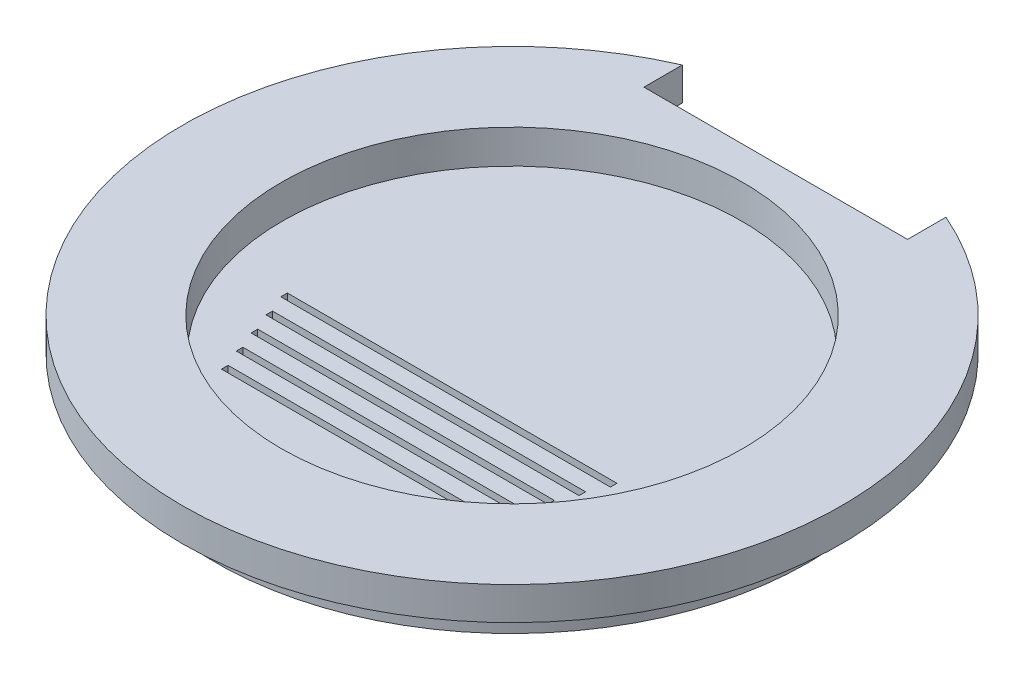
ISO-10303-21;
HEADER;
FILE_DESCRIPTION(('STEP AP214'),'2;1');
FILE_NAME('part.step','',(''),(''),'','','');
FILE_SCHEMA(('AUTOMOTIVE_DESIGN { 1 0 10303 214 1 1 1 1 }'));
ENDSEC;
DATA;
#1=APPLICATION_CONTEXT('core data for automotive mechanical design processes');
#2=APPLICATION_PROTOCOL_DEFINITION('international standard','automotive_design',2000,#1);
#3=PRODUCT_CONTEXT('',#1,'mechanical');
#4=PRODUCT('Part','Part','',(#3));
#5=PRODUCT_RELATED_PRODUCT_CATEGORY('part','',(#4));
#6=PRODUCT_DEFINITION_FORMATION('','',#4);
#7=PRODUCT_DEFINITION_CONTEXT('part definition',#1,'design');
#8=PRODUCT_DEFINITION('design','',#6,#7);
#9=PRODUCT_DEFINITION_SHAPE('','',#8);
#10=(LENGTH_UNIT() NAMED_UNIT(*) SI_UNIT(.MILLI.,.METRE.));
#11=(NAMED_UNIT(*) PLANE_ANGLE_UNIT() SI_UNIT($,.RADIAN.));
#12=(NAMED_UNIT(*) SI_UNIT($,.STERADIAN.) SOLID_ANGLE_UNIT());
#13=UNCERTAINTY_MEASURE_WITH_UNIT(LENGTH_MEASURE(1.E-05),#10,'distance_accuracy_value','');
#14=(GEOMETRIC_REPRESENTATION_CONTEXT(3) GLOBAL_UNCERTAINTY_ASSIGNED_CONTEXT((#13)) GLOBAL_UNIT_ASSIGNED_CONTEXT((#10,
#11,#12)) REPRESENTATION_CONTEXT('',''));
#15=CARTESIAN_POINT('',(0.,0.,0.));
#16=DIRECTION('',(0.,0.,1.));
#17=DIRECTION('',(1.,0.,0.));
#18=AXIS2_PLACEMENT_3D('',#15,#16,#17);
#19=CARTESIAN_POINT('',(40.,-10.,0.));
#20=DIRECTION('',(1.,0.,0.));
#21=DIRECTION('',(0.,0.,-1.));
#22=AXIS2_PLACEMENT_3D('',#19,#20,#21);
#23=PLANE('',#22);
#24=DIRECTION('',(0.,0.,1.));
#25=VECTOR('',#24,1.);
#26=CARTESIAN_POINT('',(40.,0.,0.));
#27=LINE('',#26,#25);
#28=CARTESIAN_POINT('',(40.,0.,46.1733036196664));
#29=VERTEX_POINT('',#28);
#30=CARTESIAN_POINT('',(40.,0.,48.1733036196664));
#31=VERTEX_POINT('',#30);
#32=EDGE_CURVE('E372',#29,#31,#27,.T.);
#33=ORIENTED_EDGE('',*,*,#32,.F.);
#34=DIRECTION('',(0.,1.,0.));
#35=VECTOR('',#34,1.);
#36=CARTESIAN_POINT('',(40.,-10.,46.1733036196664));
#37=LINE('',#36,#35);
#38=CARTESIAN_POINT('',(40.,-10.,46.1733036196664));
#39=VERTEX_POINT('',#38);
#40=EDGE_CURVE('E355',#39,#29,#37,.T.);
#41=ORIENTED_EDGE('',*,*,#40,.F.);
#42=DIRECTION('',(0.,0.,-1.));
#43=VECTOR('',#42,1.);
#44=CARTESIAN_POINT('',(40.,-10.,0.));
#45=LINE('',#44,#43);
#46=CARTESIAN_POINT('',(40.,-10.,48.1733036196664));
#47=VERTEX_POINT('',#46);
#48=EDGE_CURVE('E341',#47,#39,#45,.T.);
#49=ORIENTED_EDGE('',*,*,#48,.F.);
#50=DIRECTION('',(0.,1.,0.));
#51=VECTOR('',#50,1.);
#52=CARTESIAN_POINT('',(40.,-10.,48.1733036196664));
#53=LINE('',#52,#51);
#54=EDGE_CURVE('E368',#47,#31,#53,.T.);
#55=ORIENTED_EDGE('',*,*,#54,.T.);
#56=EDGE_LOOP('',(#33,#41,#49,#55));
#57=FACE_BOUND('',#56,.T.);
#58=ADVANCED_FACE('F39',(#57),#23,.F.);
#59=CARTESIAN_POINT('',(0.,-10.,48.1733036196664));
#60=DIRECTION('',(0.,0.,-1.));
#61=DIRECTION('',(-1.,0.,0.));
#62=AXIS2_PLACEMENT_3D('',#59,#60,#61);
#63=PLANE('',#62);
#64=DIRECTION('',(0.,1.,0.));
#65=VECTOR('',#64,1.);
#66=CARTESIAN_POINT('',(-40.,-10.,48.1733036196664));
#67=LINE('',#66,#65);
#68=CARTESIAN_POINT('',(-40.,-10.,48.1733036196664));
#69=VERTEX_POINT('',#68);
#70=CARTESIAN_POINT('',(-40.,0.,48.1733036196664));
#71=VERTEX_POINT('',#70);
#72=EDGE_CURVE('E364',#69,#71,#67,.T.);
#73=ORIENTED_EDGE('',*,*,#72,.T.);
#74=DIRECTION('',(1.,0.,0.));
#75=VECTOR('',#74,1.);
#76=CARTESIAN_POINT('',(0.,0.,48.1733036196664));
#77=LINE('',#76,#75);
#78=EDGE_CURVE('E584',#71,#31,#77,.T.);
#79=ORIENTED_EDGE('',*,*,#78,.T.);
#80=ORIENTED_EDGE('',*,*,#54,.F.);
#81=DIRECTION('',(-1.,0.,0.));
#82=VECTOR('',#81,1.);
#83=CARTESIAN_POINT('',(0.,-10.,48.1733036196664));
#84=LINE('',#83,#82);
#85=EDGE_CURVE('E359',#47,#69,#84,.T.);
#86=ORIENTED_EDGE('',*,*,#85,.T.);
#87=EDGE_LOOP('',(#73,#79,#80,#86));
#88=FACE_BOUND('',#87,.T.);
#89=ADVANCED_FACE('F484',(#88),#63,.T.);
#90=CARTESIAN_POINT('',(-40.,-10.,0.));
#91=DIRECTION('',(1.,0.,0.));
#92=DIRECTION('',(0.,0.,-1.));
#93=AXIS2_PLACEMENT_3D('',#90,#91,#92);
#94=PLANE('',#93);
#95=DIRECTION('',(0.,1.,0.));
#96=VECTOR('',#95,1.);
#97=CARTESIAN_POINT('',(-40.,-10.,46.1733036196664));
#98=LINE('',#97,#96);
#99=CARTESIAN_POINT('',(-40.,-10.,46.1733036196664));
#100=VERTEX_POINT('',#99);
#101=CARTESIAN_POINT('',(-40.,0.,46.1733036196664));
#102=VERTEX_POINT('',#101);
#103=EDGE_CURVE('E360',#100,#102,#98,.T.);
#104=ORIENTED_EDGE('',*,*,#103,.T.);
#105=DIRECTION('',(0.,0.,1.));
#106=VECTOR('',#105,1.);
#107=CARTESIAN_POINT('',(-40.,0.,0.));
#108=LINE('',#107,#106);
#109=EDGE_CURVE('E55',#102,#71,#108,.T.);
#110=ORIENTED_EDGE('',*,*,#109,.T.);
#111=ORIENTED_EDGE('',*,*,#72,.F.);
#112=DIRECTION('',(0.,0.,-1.));
#113=VECTOR('',#112,1.);
#114=CARTESIAN_POINT('',(-40.,-10.,0.));
#115=LINE('',#114,#113);
#116=EDGE_CURVE('E375',#69,#100,#115,.T.);
#117=ORIENTED_EDGE('',*,*,#116,.T.);
#118=EDGE_LOOP('',(#104,#110,#111,#117));
#119=FACE_BOUND('',#118,.T.);
#120=ADVANCED_FACE('F490',(#119),#94,.T.);
#121=CARTESIAN_POINT('',(0.,-10.,46.1733036196664));
#122=DIRECTION('',(0.,0.,-1.));
#123=DIRECTION('',(-1.,0.,0.));
#124=AXIS2_PLACEMENT_3D('',#121,#122,#123);
#125=PLANE('',#124);
#126=DIRECTION('',(1.,0.,0.));
#127=VECTOR('',#126,1.);
#128=CARTESIAN_POINT('',(0.,0.,46.1733036196664));
#129=LINE('',#128,#127);
#130=EDGE_CURVE('E590',#102,#29,#129,.T.);
#131=ORIENTED_EDGE('',*,*,#130,.F.);
#132=ORIENTED_EDGE('',*,*,#103,.F.);
#133=DIRECTION('',(-1.,0.,0.));
#134=VECTOR('',#133,1.);
#135=CARTESIAN_POINT('',(0.,-10.,46.1733036196664));
#136=LINE('',#135,#134);
#137=EDGE_CURVE('E379',#39,#100,#136,.T.);
#138=ORIENTED_EDGE('',*,*,#137,.F.);
#139=ORIENTED_EDGE('',*,*,#40,.T.);
#140=EDGE_LOOP('',(#131,#132,#138,#139));
#141=FACE_BOUND('',#140,.T.);
#142=ADVANCED_FACE('F498',(#141),#125,.F.);
#143=CARTESIAN_POINT('',(42.5000000000001,-10.,1.47451495458029E-13));
#144=DIRECTION('',(1.,0.,0.));
#145=DIRECTION('',(0.,0.,-1.));
#146=AXIS2_PLACEMENT_3D('',#143,#144,#145);
#147=PLANE('',#146);
#148=DIRECTION('',(0.,0.,1.));
#149=VECTOR('',#148,1.);
#150=CARTESIAN_POINT('',(42.5000000000001,0.,1.47451495458029E-13));
#151=LINE('',#150,#149);
#152=CARTESIAN_POINT('',(42.5,0.,39.1733036196664));
#153=VERTEX_POINT('',#152);
#154=CARTESIAN_POINT('',(42.5,0.,41.1733036196664));
#155=VERTEX_POINT('',#154);
#156=EDGE_CURVE('E593',#153,#155,#151,.T.);
#157=ORIENTED_EDGE('',*,*,#156,.F.);
#158=DIRECTION('',(0.,1.,0.));
#159=VECTOR('',#158,1.);
#160=CARTESIAN_POINT('',(42.5,-10.,39.1733036196664));
#161=LINE('',#160,#159);
#162=CARTESIAN_POINT('',(42.5,-10.,39.1733036196664));
#163=VERTEX_POINT('',#162);
#164=EDGE_CURVE('E324',#163,#153,#161,.T.);
#165=ORIENTED_EDGE('',*,*,#164,.F.);
#166=DIRECTION('',(0.,0.,-1.));
#167=VECTOR('',#166,1.);
#168=CARTESIAN_POINT('',(42.5000000000001,-10.,1.47451495458029E-13));
#169=LINE('',#168,#167);
#170=CARTESIAN_POINT('',(42.5,-10.,41.1733036196664));
#171=VERTEX_POINT('',#170);
#172=EDGE_CURVE('E310',#171,#163,#169,.T.);
#173=ORIENTED_EDGE('',*,*,#172,.F.);
#174=DIRECTION('',(0.,1.,0.));
#175=VECTOR('',#174,1.);
#176=CARTESIAN_POINT('',(42.5,-10.,41.1733036196664));
#177=LINE('',#176,#175);
#178=EDGE_CURVE('E337',#171,#155,#177,.T.);
#179=ORIENTED_EDGE('',*,*,#178,.T.);
#180=EDGE_LOOP('',(#157,#165,#173,#179));
#181=FACE_BOUND('',#180,.T.);
#182=ADVANCED_FACE('F501',(#181),#147,.F.);
#183=CARTESIAN_POINT('',(0.,-10.,41.1733036196664));
#184=DIRECTION('',(0.,0.,-1.));
#185=DIRECTION('',(-1.,0.,0.));
#186=AXIS2_PLACEMENT_3D('',#183,#184,#185);
#187=PLANE('',#186);
#188=DIRECTION('',(0.,1.,0.));
#189=VECTOR('',#188,1.);
#190=CARTESIAN_POINT('',(-42.5,-10.,41.1733036196664));
#191=LINE('',#190,#189);
#192=CARTESIAN_POINT('',(-42.5,-10.,41.1733036196664));
#193=VERTEX_POINT('',#192);
#194=CARTESIAN_POINT('',(-42.5,0.,41.1733036196664));
#195=VERTEX_POINT('',#194);
#196=EDGE_CURVE('E333',#193,#195,#191,.T.);
#197=ORIENTED_EDGE('',*,*,#196,.T.);
#198=DIRECTION('',(1.,0.,0.));
#199=VECTOR('',#198,1.);
#200=CARTESIAN_POINT('',(0.,0.,41.1733036196664));
#201=LINE('',#200,#199);
#202=EDGE_CURVE('E596',#195,#155,#201,.T.);
#203=ORIENTED_EDGE('',*,*,#202,.T.);
#204=ORIENTED_EDGE('',*,*,#178,.F.);
#205=DIRECTION('',(-1.,0.,0.));
#206=VECTOR('',#205,1.);
#207=CARTESIAN_POINT('',(0.,-10.,41.1733036196664));
#208=LINE('',#207,#206);
#209=EDGE_CURVE('E328',#171,#193,#208,.T.);
#210=ORIENTED_EDGE('',*,*,#209,.T.);
#211=EDGE_LOOP('',(#197,#203,#204,#210));
#212=FACE_BOUND('',#211,.T.);
#213=ADVANCED_FACE('F496',(#212),#187,.T.);
#214=CARTESIAN_POINT('',(-42.5000000000001,-10.,1.47451495458029E-13));
#215=DIRECTION('',(1.,0.,0.));
#216=DIRECTION('',(0.,0.,-1.));
#217=AXIS2_PLACEMENT_3D('',#214,#215,#216);
#218=PLANE('',#217);
#219=DIRECTION('',(0.,1.,0.));
#220=VECTOR('',#219,1.);
#221=CARTESIAN_POINT('',(-42.5,-10.,39.1733036196664));
#222=LINE('',#221,#220);
#223=CARTESIAN_POINT('',(-42.5,-10.,39.1733036196664));
#224=VERTEX_POINT('',#223);
#225=CARTESIAN_POINT('',(-42.5,0.,39.1733036196664));
#226=VERTEX_POINT('',#225);
#227=EDGE_CURVE('E329',#224,#226,#222,.T.);
#228=ORIENTED_EDGE('',*,*,#227,.T.);
#229=DIRECTION('',(0.,0.,1.));
#230=VECTOR('',#229,1.);
#231=CARTESIAN_POINT('',(-42.5000000000001,0.,1.47451495458029E-13));
#232=LINE('',#231,#230);
#233=EDGE_CURVE('E63',#226,#195,#232,.T.);
#234=ORIENTED_EDGE('',*,*,#233,.T.);
#235=ORIENTED_EDGE('',*,*,#196,.F.);
#236=DIRECTION('',(0.,0.,-1.));
#237=VECTOR('',#236,1.);
#238=CARTESIAN_POINT('',(-42.5000000000001,-10.,1.47451495458029E-13));
#239=LINE('',#238,#237);
#240=EDGE_CURVE('E344',#193,#224,#239,.T.);
#241=ORIENTED_EDGE('',*,*,#240,.T.);
#242=EDGE_LOOP('',(#228,#234,#235,#241));
#243=FACE_BOUND('',#242,.T.);
#244=ADVANCED_FACE('F703',(#243),#218,.T.);
#245=CARTESIAN_POINT('',(0.,-10.,39.1733036196664));
#246=DIRECTION('',(0.,0.,-1.));
#247=DIRECTION('',(-1.,0.,0.));
#248=AXIS2_PLACEMENT_3D('',#245,#246,#247);
#249=PLANE('',#248);
#250=DIRECTION('',(1.,0.,0.));
#251=VECTOR('',#250,1.);
#252=CARTESIAN_POINT('',(0.,0.,39.1733036196664));
#253=LINE('',#252,#251);
#254=EDGE_CURVE('E602',#226,#153,#253,.T.);
#255=ORIENTED_EDGE('',*,*,#254,.F.);
#256=ORIENTED_EDGE('',*,*,#227,.F.);
#257=DIRECTION('',(-1.,0.,0.));
#258=VECTOR('',#257,1.);
#259=CARTESIAN_POINT('',(0.,-10.,39.1733036196664));
#260=LINE('',#259,#258);
#261=EDGE_CURVE('E348',#163,#224,#260,.T.);
#262=ORIENTED_EDGE('',*,*,#261,.F.);
#263=ORIENTED_EDGE('',*,*,#164,.T.);
#264=EDGE_LOOP('',(#255,#256,#262,#263));
#265=FACE_BOUND('',#264,.T.);
#266=ADVANCED_FACE('F687',(#265),#249,.F.);
#267=CARTESIAN_POINT('',(44.9999999999999,-10.,-1.56125112837912E-13));
#268=DIRECTION('',(1.,0.,0.));
#269=DIRECTION('',(0.,0.,-1.));
#270=AXIS2_PLACEMENT_3D('',#267,#268,#269);
#271=PLANE('',#270);
#272=DIRECTION('',(0.,0.,1.));
#273=VECTOR('',#272,1.);
#274=CARTESIAN_POINT('',(44.9999999999999,0.,-1.56125112837912E-13));
#275=LINE('',#274,#273);
#276=CARTESIAN_POINT('',(45.,0.,32.1733036196664));
#277=VERTEX_POINT('',#276);
#278=CARTESIAN_POINT('',(45.,0.,34.1733036196664));
#279=VERTEX_POINT('',#278);
#280=EDGE_CURVE('E605',#277,#279,#275,.T.);
#281=ORIENTED_EDGE('',*,*,#280,.F.);
#282=DIRECTION('',(0.,1.,0.));
#283=VECTOR('',#282,1.);
#284=CARTESIAN_POINT('',(45.,-10.,32.1733036196664));
#285=LINE('',#284,#283);
#286=CARTESIAN_POINT('',(45.,-10.,32.1733036196664));
#287=VERTEX_POINT('',#286);
#288=EDGE_CURVE('E293',#287,#277,#285,.T.);
#289=ORIENTED_EDGE('',*,*,#288,.F.);
#290=DIRECTION('',(0.,0.,-1.));
#291=VECTOR('',#290,1.);
#292=CARTESIAN_POINT('',(44.9999999999999,-10.,-1.56125112837912E-13));
#293=LINE('',#292,#291);
#294=CARTESIAN_POINT('',(45.,-10.,34.1733036196664));
#295=VERTEX_POINT('',#294);
#296=EDGE_CURVE('E277',#295,#287,#293,.T.);
#297=ORIENTED_EDGE('',*,*,#296,.F.);
#298=DIRECTION('',(0.,1.,0.));
#299=VECTOR('',#298,1.);
#300=CARTESIAN_POINT('',(45.,-10.,34.1733036196664));
#301=LINE('',#300,#299);
#302=EDGE_CURVE('E306',#295,#279,#301,.T.);
#303=ORIENTED_EDGE('',*,*,#302,.T.);
#304=EDGE_LOOP('',(#281,#289,#297,#303));
#305=FACE_BOUND('',#304,.T.);
#306=ADVANCED_FACE('F683',(#305),#271,.F.);
#307=CARTESIAN_POINT('',(0.,-10.,34.1733036196664));
#308=DIRECTION('',(0.,0.,-1.));
#309=DIRECTION('',(-1.,0.,0.));
#310=AXIS2_PLACEMENT_3D('',#307,#308,#309);
#311=PLANE('',#310);
#312=DIRECTION('',(0.,1.,0.));
#313=VECTOR('',#312,1.);
#314=CARTESIAN_POINT('',(-45.,-10.,34.1733036196664));
#315=LINE('',#314,#313);
#316=CARTESIAN_POINT('',(-45.,-10.,34.1733036196664));
#317=VERTEX_POINT('',#316);
#318=CARTESIAN_POINT('',(-45.,0.,34.1733036196664));
#319=VERTEX_POINT('',#318);
#320=EDGE_CURVE('E302',#317,#319,#315,.T.);
#321=ORIENTED_EDGE('',*,*,#320,.T.);
#322=DIRECTION('',(1.,0.,0.));
#323=VECTOR('',#322,1.);
#324=CARTESIAN_POINT('',(0.,0.,34.1733036196664));
#325=LINE('',#324,#323);
#326=EDGE_CURVE('E608',#319,#279,#325,.T.);
#327=ORIENTED_EDGE('',*,*,#326,.T.);
#328=ORIENTED_EDGE('',*,*,#302,.F.);
#329=DIRECTION('',(-1.,0.,0.));
#330=VECTOR('',#329,1.);
#331=CARTESIAN_POINT('',(0.,-10.,34.1733036196664));
#332=LINE('',#331,#330);
#333=EDGE_CURVE('E297',#295,#317,#332,.T.);
#334=ORIENTED_EDGE('',*,*,#333,.T.);
#335=EDGE_LOOP('',(#321,#327,#328,#334));
#336=FACE_BOUND('',#335,.T.);
#337=ADVANCED_FACE('F686',(#336),#311,.T.);
#338=CARTESIAN_POINT('',(-44.9999999999999,-10.,-1.56125112837912E-13));
#339=DIRECTION('',(1.,0.,0.));
#340=DIRECTION('',(0.,0.,-1.));
#341=AXIS2_PLACEMENT_3D('',#338,#339,#340);
#342=PLANE('',#341);
#343=DIRECTION('',(0.,1.,0.));
#344=VECTOR('',#343,1.);
#345=CARTESIAN_POINT('',(-45.,-10.,32.1733036196664));
#346=LINE('',#345,#344);
#347=CARTESIAN_POINT('',(-45.,-10.,32.1733036196664));
#348=VERTEX_POINT('',#347);
#349=CARTESIAN_POINT('',(-45.,0.,32.1733036196664));
#350=VERTEX_POINT('',#349);
#351=EDGE_CURVE('E298',#348,#350,#346,.T.);
#352=ORIENTED_EDGE('',*,*,#351,.T.);
#353=DIRECTION('',(0.,0.,1.));
#354=VECTOR('',#353,1.);
#355=CARTESIAN_POINT('',(-44.9999999999999,0.,-1.56125112837912E-13));
#356=LINE('',#355,#354);
#357=EDGE_CURVE('E612',#350,#319,#356,.T.);
#358=ORIENTED_EDGE('',*,*,#357,.T.);
#359=ORIENTED_EDGE('',*,*,#320,.F.);
#360=DIRECTION('',(0.,0.,-1.));
#361=VECTOR('',#360,1.);
#362=CARTESIAN_POINT('',(-44.9999999999999,-10.,-1.56125112837912E-13));
#363=LINE('',#362,#361);
#364=EDGE_CURVE('E313',#317,#348,#363,.T.);
#365=ORIENTED_EDGE('',*,*,#364,.T.);
#366=EDGE_LOOP('',(#352,#358,#359,#365));
#367=FACE_BOUND('',#366,.T.);
#368=ADVANCED_FACE('F691',(#367),#342,.T.);
#369=CARTESIAN_POINT('',(0.,-10.,32.1733036196664));
#370=DIRECTION('',(0.,0.,-1.));
#371=DIRECTION('',(-1.,0.,0.));
#372=AXIS2_PLACEMENT_3D('',#369,#370,#371);
#373=PLANE('',#372);
#374=DIRECTION('',(1.,0.,0.));
#375=VECTOR('',#374,1.);
#376=CARTESIAN_POINT('',(0.,0.,32.1733036196664));
#377=LINE('',#376,#375);
#378=EDGE_CURVE('E616',#350,#277,#377,.T.);
#379=ORIENTED_EDGE('',*,*,#378,.F.);
#380=ORIENTED_EDGE('',*,*,#351,.F.);
#381=DIRECTION('',(-1.,0.,0.));
#382=VECTOR('',#381,1.);
#383=CARTESIAN_POINT('',(0.,-10.,32.1733036196664));
#384=LINE('',#383,#382);
#385=EDGE_CURVE('E317',#287,#348,#384,.T.);
#386=ORIENTED_EDGE('',*,*,#385,.F.);
#387=ORIENTED_EDGE('',*,*,#288,.T.);
#388=EDGE_LOOP('',(#379,#380,#386,#387));
#389=FACE_BOUND('',#388,.T.);
#390=ADVANCED_FACE('F671',(#389),#373,.F.);
#391=CARTESIAN_POINT('',(47.5000000000001,-10.,1.64798730217797E-13));
#392=DIRECTION('',(1.,0.,0.));
#393=DIRECTION('',(0.,0.,-1.));
#394=AXIS2_PLACEMENT_3D('',#391,#392,#393);
#395=PLANE('',#394);
#396=DIRECTION('',(0.,0.,1.));
#397=VECTOR('',#396,1.);
#398=CARTESIAN_POINT('',(47.5000000000001,0.,1.64798730217797E-13));
#399=LINE('',#398,#397);
#400=CARTESIAN_POINT('',(47.5,0.,25.1733036196664));
#401=VERTEX_POINT('',#400);
#402=CARTESIAN_POINT('',(47.5,0.,27.1733036196664));
#403=VERTEX_POINT('',#402);
#404=EDGE_CURVE('E619',#401,#403,#399,.T.);
#405=ORIENTED_EDGE('',*,*,#404,.F.);
#406=DIRECTION('',(0.,1.,0.));
#407=VECTOR('',#406,1.);
#408=CARTESIAN_POINT('',(47.5,-10.,25.1733036196664));
#409=LINE('',#408,#407);
#410=CARTESIAN_POINT('',(47.5,-10.,25.1733036196664));
#411=VERTEX_POINT('',#410);
#412=EDGE_CURVE('E260',#411,#401,#409,.T.);
#413=ORIENTED_EDGE('',*,*,#412,.F.);
#414=DIRECTION('',(0.,0.,-1.));
#415=VECTOR('',#414,1.);
#416=CARTESIAN_POINT('',(47.5000000000001,-10.,1.64798730217797E-13));
#417=LINE('',#416,#415);
#418=CARTESIAN_POINT('',(47.5,-10.,27.1733036196664));
#419=VERTEX_POINT('',#418);
#420=EDGE_CURVE('E288',#419,#411,#417,.T.);
#421=ORIENTED_EDGE('',*,*,#420,.F.);
#422=DIRECTION('',(0.,1.,0.));
#423=VECTOR('',#422,1.);
#424=CARTESIAN_POINT('',(47.5,-10.,27.1733036196664));
#425=LINE('',#424,#423);
#426=EDGE_CURVE('E273',#419,#403,#425,.T.);
#427=ORIENTED_EDGE('',*,*,#426,.T.);
#428=EDGE_LOOP('',(#405,#413,#421,#427));
#429=FACE_BOUND('',#428,.T.);
#430=ADVANCED_FACE('F667',(#429),#395,.F.);
#431=CARTESIAN_POINT('',(0.,-10.,27.1733036196664));
#432=DIRECTION('',(0.,0.,-1.));
#433=DIRECTION('',(-1.,0.,0.));
#434=AXIS2_PLACEMENT_3D('',#431,#432,#433);
#435=PLANE('',#434);
#436=DIRECTION('',(0.,1.,0.));
#437=VECTOR('',#436,1.);
#438=CARTESIAN_POINT('',(-47.5,-10.,27.1733036196664));
#439=LINE('',#438,#437);
#440=CARTESIAN_POINT('',(-47.5,-10.,27.1733036196664));
#441=VERTEX_POINT('',#440);
#442=CARTESIAN_POINT('',(-47.5,0.,27.1733036196664));
#443=VERTEX_POINT('',#442);
#444=EDGE_CURVE('E269',#441,#443,#439,.T.);
#445=ORIENTED_EDGE('',*,*,#444,.T.);
#446=DIRECTION('',(1.,0.,0.));
#447=VECTOR('',#446,1.);
#448=CARTESIAN_POINT('',(0.,0.,27.1733036196664));
#449=LINE('',#448,#447);
#450=EDGE_CURVE('E622',#443,#403,#449,.T.);
#451=ORIENTED_EDGE('',*,*,#450,.T.);
#452=ORIENTED_EDGE('',*,*,#426,.F.);
#453=DIRECTION('',(-1.,0.,0.));
#454=VECTOR('',#453,1.);
#455=CARTESIAN_POINT('',(0.,-10.,27.1733036196664));
#456=LINE('',#455,#454);
#457=EDGE_CURVE('E264',#419,#441,#456,.T.);
#458=ORIENTED_EDGE('',*,*,#457,.T.);
#459=EDGE_LOOP('',(#445,#451,#452,#458));
#460=FACE_BOUND('',#459,.T.);
#461=ADVANCED_FACE('F670',(#460),#435,.T.);
#462=CARTESIAN_POINT('',(-47.5000000000001,-10.,1.64798730217797E-13));
#463=DIRECTION('',(1.,0.,0.));
#464=DIRECTION('',(0.,0.,-1.));
#465=AXIS2_PLACEMENT_3D('',#462,#463,#464);
#466=PLANE('',#465);
#467=DIRECTION('',(0.,1.,0.));
#468=VECTOR('',#467,1.);
#469=CARTESIAN_POINT('',(-47.5,-10.,25.1733036196664));
#470=LINE('',#469,#468);
#471=CARTESIAN_POINT('',(-47.5,-10.,25.1733036196664));
#472=VERTEX_POINT('',#471);
#473=CARTESIAN_POINT('',(-47.5,0.,25.1733036196664));
#474=VERTEX_POINT('',#473);
#475=EDGE_CURVE('E265',#472,#474,#470,.T.);
#476=ORIENTED_EDGE('',*,*,#475,.T.);
#477=DIRECTION('',(0.,0.,1.));
#478=VECTOR('',#477,1.);
#479=CARTESIAN_POINT('',(-47.5000000000001,0.,1.64798730217797E-13));
#480=LINE('',#479,#478);
#481=EDGE_CURVE('E626',#474,#443,#480,.T.);
#482=ORIENTED_EDGE('',*,*,#481,.T.);
#483=ORIENTED_EDGE('',*,*,#444,.F.);
#484=DIRECTION('',(0.,0.,-1.));
#485=VECTOR('',#484,1.);
#486=CARTESIAN_POINT('',(-47.5000000000001,-10.,1.64798730217797E-13));
#487=LINE('',#486,#485);
#488=EDGE_CURVE('E280',#441,#472,#487,.T.);
#489=ORIENTED_EDGE('',*,*,#488,.T.);
#490=EDGE_LOOP('',(#476,#482,#483,#489));
#491=FACE_BOUND('',#490,.T.);
#492=ADVANCED_FACE('F675',(#491),#466,.T.);
#493=CARTESIAN_POINT('',(0.,-10.,25.1733036196664));
#494=DIRECTION('',(0.,0.,-1.));
#495=DIRECTION('',(-1.,0.,0.));
#496=AXIS2_PLACEMENT_3D('',#493,#494,#495);
#497=PLANE('',#496);
#498=DIRECTION('',(1.,0.,0.));
#499=VECTOR('',#498,1.);
#500=CARTESIAN_POINT('',(0.,0.,25.1733036196664));
#501=LINE('',#500,#499);
#502=EDGE_CURVE('E241',#474,#401,#501,.T.);
#503=ORIENTED_EDGE('',*,*,#502,.F.);
#504=ORIENTED_EDGE('',*,*,#475,.F.);
#505=DIRECTION('',(-1.,0.,0.));
#506=VECTOR('',#505,1.);
#507=CARTESIAN_POINT('',(0.,-10.,25.1733036196664));
#508=LINE('',#507,#506);
#509=EDGE_CURVE('E284',#411,#472,#508,.T.);
#510=ORIENTED_EDGE('',*,*,#509,.F.);
#511=ORIENTED_EDGE('',*,*,#412,.T.);
#512=EDGE_LOOP('',(#503,#504,#510,#511));
#513=FACE_BOUND('',#512,.T.);
#514=ADVANCED_FACE('F666',(#513),#497,.F.);
#515=CARTESIAN_POINT('',(50.,-10.,0.));
#516=DIRECTION('',(1.,0.,0.));
#517=DIRECTION('',(0.,0.,-1.));
#518=AXIS2_PLACEMENT_3D('',#515,#516,#517);
#519=PLANE('',#518);
#520=DIRECTION('',(0.,0.,1.));
#521=VECTOR('',#520,1.);
#522=CARTESIAN_POINT('',(50.,0.,0.));
#523=LINE('',#522,#521);
#524=CARTESIAN_POINT('',(50.,0.,18.1733036196664));
#525=VERTEX_POINT('',#524);
#526=CARTESIAN_POINT('',(50.,0.,20.1733036196664));
#527=VERTEX_POINT('',#526);
#528=EDGE_CURVE('E226',#525,#527,#523,.T.);
#529=ORIENTED_EDGE('',*,*,#528,.F.);
#530=DIRECTION('',(0.,1.,0.));
#531=VECTOR('',#530,1.);
#532=CARTESIAN_POINT('',(50.,-10.,18.1733036196664));
#533=LINE('',#532,#531);
#534=CARTESIAN_POINT('',(50.,-10.,18.1733036196664));
#535=VERTEX_POINT('',#534);
#536=EDGE_CURVE('E237',#535,#525,#533,.T.);
#537=ORIENTED_EDGE('',*,*,#536,.F.);
#538=DIRECTION('',(0.,0.,-1.));
#539=VECTOR('',#538,1.);
#540=CARTESIAN_POINT('',(50.,-10.,0.));
#541=LINE('',#540,#539);
#542=CARTESIAN_POINT('',(50.,-10.,20.1733036196664));
#543=VERTEX_POINT('',#542);
#544=EDGE_CURVE('E292',#543,#535,#541,.T.);
#545=ORIENTED_EDGE('',*,*,#544,.F.);
#546=DIRECTION('',(0.,1.,0.));
#547=VECTOR('',#546,1.);
#548=CARTESIAN_POINT('',(50.,-10.,20.1733036196664));
#549=LINE('',#548,#547);
#550=EDGE_CURVE('E239',#543,#527,#549,.T.);
#551=ORIENTED_EDGE('',*,*,#550,.T.);
#552=EDGE_LOOP('',(#529,#537,#545,#551));
#553=FACE_BOUND('',#552,.T.);
#554=ADVANCED_FACE('F235',(#553),#519,.F.);
#555=CARTESIAN_POINT('',(0.,-10.,20.1733036196664));
#556=DIRECTION('',(0.,0.,-1.));
#557=DIRECTION('',(-1.,0.,0.));
#558=AXIS2_PLACEMENT_3D('',#555,#556,#557);
#559=PLANE('',#558);
#560=DIRECTION('',(0.,1.,0.));
#561=VECTOR('',#560,1.);
#562=CARTESIAN_POINT('',(-50.,-10.,20.1733036196664));
#563=LINE('',#562,#561);
#564=CARTESIAN_POINT('',(-50.,-10.,20.1733036196664));
#565=VERTEX_POINT('',#564);
#566=CARTESIAN_POINT('',(-50.,0.,20.1733036196664));
#567=VERTEX_POINT('',#566);
#568=EDGE_CURVE('E254',#565,#567,#563,.T.);
#569=ORIENTED_EDGE('',*,*,#568,.T.);
#570=DIRECTION('',(1.,0.,0.));
#571=VECTOR('',#570,1.);
#572=CARTESIAN_POINT('',(0.,0.,20.1733036196664));
#573=LINE('',#572,#571);
#574=EDGE_CURVE('E242',#567,#527,#573,.T.);
#575=ORIENTED_EDGE('',*,*,#574,.T.);
#576=ORIENTED_EDGE('',*,*,#550,.F.);
#577=DIRECTION('',(-1.,0.,0.));
#578=VECTOR('',#577,1.);
#579=CARTESIAN_POINT('',(0.,-10.,20.1733036196664));
#580=LINE('',#579,#578);
#581=EDGE_CURVE('E250',#543,#565,#580,.T.);
#582=ORIENTED_EDGE('',*,*,#581,.T.);
#583=EDGE_LOOP('',(#569,#575,#576,#582));
#584=FACE_BOUND('',#583,.T.);
#585=ADVANCED_FACE('F655',(#584),#559,.T.);
#586=CARTESIAN_POINT('',(-50.,-10.,0.));
#587=DIRECTION('',(1.,0.,0.));
#588=DIRECTION('',(0.,0.,-1.));
#589=AXIS2_PLACEMENT_3D('',#586,#587,#588);
#590=PLANE('',#589);
#591=DIRECTION('',(0.,1.,0.));
#592=VECTOR('',#591,1.);
#593=CARTESIAN_POINT('',(-50.,-10.,18.1733036196664));
#594=LINE('',#593,#592);
#595=CARTESIAN_POINT('',(-50.,-10.,18.1733036196664));
#596=VERTEX_POINT('',#595);
#597=CARTESIAN_POINT('',(-50.,0.,18.1733036196664));
#598=VERTEX_POINT('',#597);
#599=EDGE_CURVE('E249',#596,#598,#594,.T.);
#600=ORIENTED_EDGE('',*,*,#599,.T.);
#601=DIRECTION('',(0.,0.,1.));
#602=VECTOR('',#601,1.);
#603=CARTESIAN_POINT('',(-50.,0.,0.));
#604=LINE('',#603,#602);
#605=EDGE_CURVE('E229',#598,#567,#604,.T.);
#606=ORIENTED_EDGE('',*,*,#605,.T.);
#607=ORIENTED_EDGE('',*,*,#568,.F.);
#608=DIRECTION('',(0.,0.,-1.));
#609=VECTOR('',#608,1.);
#610=CARTESIAN_POINT('',(-50.,-10.,0.));
#611=LINE('',#610,#609);
#612=EDGE_CURVE('E256',#565,#596,#611,.T.);
#613=ORIENTED_EDGE('',*,*,#612,.T.);
#614=EDGE_LOOP('',(#600,#606,#607,#613));
#615=FACE_BOUND('',#614,.T.);
#616=ADVANCED_FACE('F658',(#615),#590,.T.);
#617=CARTESIAN_POINT('',(0.,-10.,18.1733036196664));
#618=DIRECTION('',(0.,0.,-1.));
#619=DIRECTION('',(-1.,0.,0.));
#620=AXIS2_PLACEMENT_3D('',#617,#618,#619);
#621=PLANE('',#620);
#622=DIRECTION('',(1.,0.,0.));
#623=VECTOR('',#622,1.);
#624=CARTESIAN_POINT('',(0.,0.,18.1733036196664));
#625=LINE('',#624,#623);
#626=EDGE_CURVE('E11',#598,#525,#625,.T.);
#627=ORIENTED_EDGE('',*,*,#626,.F.);
#628=ORIENTED_EDGE('',*,*,#599,.F.);
#629=DIRECTION('',(-1.,0.,0.));
#630=VECTOR('',#629,1.);
#631=CARTESIAN_POINT('',(0.,-10.,18.1733036196664));
#632=LINE('',#631,#630);
#633=EDGE_CURVE('E246',#535,#596,#632,.T.);
#634=ORIENTED_EDGE('',*,*,#633,.F.);
#635=ORIENTED_EDGE('',*,*,#536,.T.);
#636=EDGE_LOOP('',(#627,#628,#634,#635));
#637=FACE_BOUND('',#636,.T.);
#638=ADVANCED_FACE('F244',(#637),#621,.F.);
#639=CARTESIAN_POINT('',(0.,0.,0.));
#640=DIRECTION('',(0.,1.,0.));
#641=DIRECTION('',(0.,0.,1.));
#642=AXIS2_PLACEMENT_3D('',#639,#640,#641);
#643=CONICAL_SURFACE('',#642,90.,0.00872664625997167);
#644=CARTESIAN_POINT('',(0.,0.,0.));
#645=DIRECTION('',(0.,1.,0.));
#646=DIRECTION('',(0.,0.,1.));
#647=AXIS2_PLACEMENT_3D('',#644,#645,#646);
#648=CIRCLE('',#647,90.);
#649=CARTESIAN_POINT('',(-50.,0.,-74.8331477354788));
#650=VERTEX_POINT('',#649);
#651=CARTESIAN_POINT('',(50.,0.,-74.8331477354788));
#652=VERTEX_POINT('',#651);
#653=EDGE_CURVE('E421',#650,#652,#648,.T.);
#654=ORIENTED_EDGE('',*,*,#653,.F.);
#655=CARTESIAN_POINT('',(-50.0872686779076,-10.,-74.669704500459));
#656=CARTESIAN_POINT('',(-50.0727239025026,-8.33333381990958,-74.6969748122514));
#657=CARTESIAN_POINT('',(-50.0581791249745,-6.66666739653101,-74.7242302377326));
#658=CARTESIAN_POINT('',(-50.029089565672,-3.33333406319768,-74.7787113160725));
#659=CARTESIAN_POINT('',(-50.0145447838976,-1.66666715324292,-74.8059369689313));
#660=CARTESIAN_POINT('',(-50.,0.,-74.8331477354788));
#661=B_SPLINE_CURVE_WITH_KNOTS('',3,(#655,#656,#657,#658,#659,#660),.UNSPECIFIED.,.F.,.F.,(4,2,
4),(0.,5.00085816438551,10.0017163287706),.UNSPECIFIED.);
#662=CARTESIAN_POINT('',(-50.0872686779076,-10.,-74.669704500459));
#663=VERTEX_POINT('',#662);
#664=EDGE_CURVE('E48',#663,#650,#661,.T.);
#665=ORIENTED_EDGE('',*,*,#664,.F.);
#666=CARTESIAN_POINT('',(0.,-10.,0.));
#667=DIRECTION('',(0.,1.,0.));
#668=DIRECTION('',(0.,0.,1.));
#669=AXIS2_PLACEMENT_3D('',#666,#667,#668);
#670=CIRCLE('',#669,89.9127313220924);
#671=CARTESIAN_POINT('',(50.0872686779076,-10.,-74.669704500459));
#672=VERTEX_POINT('',#671);
#673=EDGE_CURVE('E445',#663,#672,#670,.T.);
#674=ORIENTED_EDGE('',*,*,#673,.T.);
#675=CARTESIAN_POINT('',(50.0872686779076,-10.,-74.669704500459));
#676=CARTESIAN_POINT('',(50.0727239025026,-8.33333381990958,-74.6969748122514));
#677=CARTESIAN_POINT('',(50.0581791249745,-6.66666739653101,-74.7242302377326));
#678=CARTESIAN_POINT('',(50.029089565672,-3.33333406319768,-74.7787113160725));
#679=CARTESIAN_POINT('',(50.0145447838976,-1.66666715324292,-74.8059369689313));
#680=CARTESIAN_POINT('',(50.,0.,-74.8331477354788));
#681=B_SPLINE_CURVE_WITH_KNOTS('',3,(#675,#676,#677,#678,#679,#680),.UNSPECIFIED.,.F.,.F.,(4,2,
4),(0.,5.00085816438551,10.0017163287706),.UNSPECIFIED.);
#682=EDGE_CURVE('E456',#672,#652,#681,.T.);
#683=ORIENTED_EDGE('',*,*,#682,.T.);
#684=EDGE_LOOP('',(#654,#665,#674,#683));
#685=FACE_BOUND('',#684,.T.);
#686=ADVANCED_FACE('F465',(#685),#643,.T.);
#687=CARTESIAN_POINT('',(-50.,0.,-74.8331477354788));
#688=DIRECTION('',(0.999961923064171,-0.00872653549837395,0.));
#689=DIRECTION('',(0.00872653549837395,0.999961923064171,0.));
#690=AXIS2_PLACEMENT_3D('',#687,#688,#689);
#691=PLANE('',#690);
#692=DIRECTION('',(0.,0.,-1.));
#693=VECTOR('',#692,1.);
#694=CARTESIAN_POINT('',(-50.,0.,-74.8331477354788));
#695=LINE('',#694,#693);
#696=CARTESIAN_POINT('',(-50.,0.,-70.));
#697=VERTEX_POINT('',#696);
#698=EDGE_CURVE('E441',#697,#650,#695,.T.);
#699=ORIENTED_EDGE('',*,*,#698,.F.);
#700=DIRECTION('',(0.00872620324394422,0.99992385047757,-0.00872620324394424));
#701=VECTOR('',#700,1.);
#702=CARTESIAN_POINT('',(-49.9996319721212,0.042171817839446,-70.0003680278788));
#703=LINE('',#702,#701);
#704=CARTESIAN_POINT('',(-50.0872686779076,-10.,-69.9127313220924));
#705=VERTEX_POINT('',#704);
#706=EDGE_CURVE('E455',#705,#697,#703,.T.);
#707=ORIENTED_EDGE('',*,*,#706,.F.);
#708=DIRECTION('',(0.,0.,-1.));
#709=VECTOR('',#708,1.);
#710=CARTESIAN_POINT('',(-50.0872686779075,-10.,0.));
#711=LINE('',#710,#709);
#712=EDGE_CURVE('E547',#705,#663,#711,.T.);
#713=ORIENTED_EDGE('',*,*,#712,.T.);
#714=ORIENTED_EDGE('',*,*,#664,.T.);
#715=EDGE_LOOP('',(#699,#707,#713,#714));
#716=FACE_BOUND('',#715,.T.);
#717=ADVANCED_FACE('F462',(#716),#691,.T.);
#718=CARTESIAN_POINT('',(-50.,0.,-70.));
#719=DIRECTION('',(0.,-0.00872653549837395,-0.999961923064171));
#720=DIRECTION('',(0.,0.999961923064171,-0.00872653549837395));
#721=AXIS2_PLACEMENT_3D('',#718,#719,#720);
#722=PLANE('',#721);
#723=DIRECTION('',(-1.,0.,0.));
#724=VECTOR('',#723,1.);
#725=CARTESIAN_POINT('',(-50.,0.,-70.));
#726=LINE('',#725,#724);
#727=CARTESIAN_POINT('',(50.,0.,-70.));
#728=VERTEX_POINT('',#727);
#729=EDGE_CURVE('E437',#728,#697,#726,.T.);
#730=ORIENTED_EDGE('',*,*,#729,.F.);
#731=DIRECTION('',(-0.00872620324394422,0.99992385047757,-0.00872620324394424));
#732=VECTOR('',#731,1.);
#733=CARTESIAN_POINT('',(49.9923853376945,0.872553874773457,-70.0076146623055));
#734=LINE('',#733,#732);
#735=CARTESIAN_POINT('',(50.0872686779076,-10.,-69.9127313220924));
#736=VERTEX_POINT('',#735);
#737=EDGE_CURVE('E564',#736,#728,#734,.T.);
#738=ORIENTED_EDGE('',*,*,#737,.F.);
#739=DIRECTION('',(-1.,0.,0.));
#740=VECTOR('',#739,1.);
#741=CARTESIAN_POINT('',(0.,-10.,-69.9127313220924));
#742=LINE('',#741,#740);
#743=EDGE_CURVE('E558',#736,#705,#742,.T.);
#744=ORIENTED_EDGE('',*,*,#743,.T.);
#745=ORIENTED_EDGE('',*,*,#706,.T.);
#746=EDGE_LOOP('',(#730,#738,#744,#745));
#747=FACE_BOUND('',#746,.T.);
#748=ADVANCED_FACE('F41',(#747),#722,.T.);
#749=CARTESIAN_POINT('',(50.,0.,-70.));
#750=DIRECTION('',(-0.999961923064171,-0.00872653549837395,0.));
#751=DIRECTION('',(0.00872653549837395,-0.999961923064171,0.));
#752=AXIS2_PLACEMENT_3D('',#749,#750,#751);
#753=PLANE('',#752);
#754=DIRECTION('',(0.,0.,1.));
#755=VECTOR('',#754,1.);
#756=CARTESIAN_POINT('',(50.,0.,-70.));
#757=LINE('',#756,#755);
#758=EDGE_CURVE('E433',#652,#728,#757,.T.);
#759=ORIENTED_EDGE('',*,*,#758,.F.);
#760=ORIENTED_EDGE('',*,*,#682,.F.);
#761=DIRECTION('',(0.,0.,1.));
#762=VECTOR('',#761,1.);
#763=CARTESIAN_POINT('',(50.0872686779075,-10.,0.));
#764=LINE('',#763,#762);
#765=EDGE_CURVE('E554',#672,#736,#764,.T.);
#766=ORIENTED_EDGE('',*,*,#765,.T.);
#767=ORIENTED_EDGE('',*,*,#737,.T.);
#768=EDGE_LOOP('',(#759,#760,#766,#767));
#769=FACE_BOUND('',#768,.T.);
#770=ADVANCED_FACE('F469',(#769),#753,.T.);
#771=CARTESIAN_POINT('',(0.,-10.,0.));
#772=DIRECTION('',(0.,1.,0.));
#773=DIRECTION('',(0.,0.,1.));
#774=AXIS2_PLACEMENT_3D('',#771,#772,#773);
#775=PLANE('',#774);
#776=ORIENTED_EDGE('',*,*,#581,.F.);
#777=ORIENTED_EDGE('',*,*,#544,.T.);
#778=ORIENTED_EDGE('',*,*,#633,.T.);
#779=ORIENTED_EDGE('',*,*,#612,.F.);
#780=EDGE_LOOP('',(#776,#777,#778,#779));
#781=FACE_BOUND('',#780,.T.);
#782=ORIENTED_EDGE('',*,*,#457,.F.);
#783=ORIENTED_EDGE('',*,*,#420,.T.);
#784=ORIENTED_EDGE('',*,*,#509,.T.);
#785=ORIENTED_EDGE('',*,*,#488,.F.);
#786=EDGE_LOOP('',(#782,#783,#784,#785));
#787=FACE_BOUND('',#786,.T.);
#788=ORIENTED_EDGE('',*,*,#333,.F.);
#789=ORIENTED_EDGE('',*,*,#296,.T.);
#790=ORIENTED_EDGE('',*,*,#385,.T.);
#791=ORIENTED_EDGE('',*,*,#364,.F.);
#792=EDGE_LOOP('',(#788,#789,#790,#791));
#793=FACE_BOUND('',#792,.T.);
#794=ORIENTED_EDGE('',*,*,#209,.F.);
#795=ORIENTED_EDGE('',*,*,#172,.T.);
#796=ORIENTED_EDGE('',*,*,#261,.T.);
#797=ORIENTED_EDGE('',*,*,#240,.F.);
#798=EDGE_LOOP('',(#794,#795,#796,#797));
#799=FACE_BOUND('',#798,.T.);
#800=ORIENTED_EDGE('',*,*,#85,.F.);
#801=ORIENTED_EDGE('',*,*,#48,.T.);
#802=ORIENTED_EDGE('',*,*,#137,.T.);
#803=ORIENTED_EDGE('',*,*,#116,.F.);
#804=EDGE_LOOP('',(#800,#801,#802,#803));
#805=FACE_BOUND('',#804,.T.);
#806=ORIENTED_EDGE('',*,*,#673,.F.);
#807=ORIENTED_EDGE('',*,*,#712,.F.);
#808=ORIENTED_EDGE('',*,*,#743,.F.);
#809=ORIENTED_EDGE('',*,*,#765,.F.);
#810=EDGE_LOOP('',(#806,#807,#808,#809));
#811=FACE_BOUND('',#810,.T.);
#812=ADVANCED_FACE('F473',(#781,#787,#793,#799,#805,#811),#775,.F.);
#813=CARTESIAN_POINT('',(0.,0.,0.));
#814=DIRECTION('',(0.,1.,0.));
#815=DIRECTION('',(0.,0.,1.));
#816=AXIS2_PLACEMENT_3D('',#813,#814,#815);
#817=PLANE('',#816);
#818=DIRECTION('',(0.,0.,1.));
#819=VECTOR('',#818,1.);
#820=CARTESIAN_POINT('',(-40.,0.,-91.6515138991168));
#821=LINE('',#820,#819);
#822=CARTESIAN_POINT('',(-40.,0.,-91.6515138991168));
#823=VERTEX_POINT('',#822);
#824=CARTESIAN_POINT('',(-40.,0.,-80.));
#825=VERTEX_POINT('',#824);
#826=EDGE_CURVE('E403',#823,#825,#821,.T.);
#827=ORIENTED_EDGE('',*,*,#826,.T.);
#828=DIRECTION('',(1.,0.,0.));
#829=VECTOR('',#828,1.);
#830=CARTESIAN_POINT('',(-40.,0.,-80.));
#831=LINE('',#830,#829);
#832=CARTESIAN_POINT('',(40.,0.,-80.));
#833=VERTEX_POINT('',#832);
#834=EDGE_CURVE('E407',#825,#833,#831,.T.);
#835=ORIENTED_EDGE('',*,*,#834,.T.);
#836=DIRECTION('',(0.,0.,-1.));
#837=VECTOR('',#836,1.);
#838=CARTESIAN_POINT('',(40.,0.,-80.));
#839=LINE('',#838,#837);
#840=CARTESIAN_POINT('',(40.,0.,-91.6515138991168));
#841=VERTEX_POINT('',#840);
#842=EDGE_CURVE('E411',#833,#841,#839,.T.);
#843=ORIENTED_EDGE('',*,*,#842,.T.);
#844=CARTESIAN_POINT('',(0.,0.,0.));
#845=DIRECTION('',(0.,1.,0.));
#846=DIRECTION('',(0.,0.,1.));
#847=AXIS2_PLACEMENT_3D('',#844,#845,#846);
#848=CIRCLE('',#847,100.);
#849=EDGE_CURVE('E391',#823,#841,#848,.T.);
#850=ORIENTED_EDGE('',*,*,#849,.F.);
#851=EDGE_LOOP('',(#827,#835,#843,#850));
#852=FACE_BOUND('',#851,.T.);
#853=ORIENTED_EDGE('',*,*,#698,.T.);
#854=ORIENTED_EDGE('',*,*,#653,.T.);
#855=ORIENTED_EDGE('',*,*,#758,.T.);
#856=ORIENTED_EDGE('',*,*,#729,.T.);
#857=EDGE_LOOP('',(#853,#854,#855,#856));
#858=FACE_BOUND('',#857,.T.);
#859=ADVANCED_FACE('F479',(#852,#858),#817,.F.);
#860=CARTESIAN_POINT('',(-40.,10.,-91.6515138991168));
#861=DIRECTION('',(1.,0.,0.));
#862=DIRECTION('',(0.,0.,-1.));
#863=AXIS2_PLACEMENT_3D('',#860,#861,#862);
#864=PLANE('',#863);
#865=ORIENTED_EDGE('',*,*,#826,.F.);
#866=DIRECTION('',(0.,-1.,0.));
#867=VECTOR('',#866,1.);
#868=CARTESIAN_POINT('',(-40.,10.,-91.6515138991168));
#869=LINE('',#868,#867);
#870=CARTESIAN_POINT('',(-40.,10.,-91.6515138991168));
#871=VERTEX_POINT('',#870);
#872=EDGE_CURVE('E418',#871,#823,#869,.T.);
#873=ORIENTED_EDGE('',*,*,#872,.F.);
#874=DIRECTION('',(0.,0.,1.));
#875=VECTOR('',#874,1.);
#876=CARTESIAN_POINT('',(-40.,10.,-91.6515138991168));
#877=LINE('',#876,#875);
#878=CARTESIAN_POINT('',(-40.,10.,-80.));
#879=VERTEX_POINT('',#878);
#880=EDGE_CURVE('E386',#871,#879,#877,.T.);
#881=ORIENTED_EDGE('',*,*,#880,.T.);
#882=DIRECTION('',(0.,-1.,0.));
#883=VECTOR('',#882,1.);
#884=CARTESIAN_POINT('',(-40.,10.,-80.));
#885=LINE('',#884,#883);
#886=EDGE_CURVE('E402',#879,#825,#885,.T.);
#887=ORIENTED_EDGE('',*,*,#886,.T.);
#888=EDGE_LOOP('',(#865,#873,#881,#887));
#889=FACE_BOUND('',#888,.T.);
#890=ADVANCED_FACE('F513',(#889),#864,.T.);
#891=CARTESIAN_POINT('',(0.,10.,0.));
#892=DIRECTION('',(0.,-1.,0.));
#893=DIRECTION('',(0.,0.,-1.));
#894=AXIS2_PLACEMENT_3D('',#891,#892,#893);
#895=CYLINDRICAL_SURFACE('',#894,100.);
#896=ORIENTED_EDGE('',*,*,#849,.T.);
#897=DIRECTION('',(0.,-1.,0.));
#898=VECTOR('',#897,1.);
#899=CARTESIAN_POINT('',(40.,10.,-91.6515138991168));
#900=LINE('',#899,#898);
#901=CARTESIAN_POINT('',(40.,10.,-91.6515138991168));
#902=VERTEX_POINT('',#901);
#903=EDGE_CURVE('E422',#902,#841,#900,.T.);
#904=ORIENTED_EDGE('',*,*,#903,.F.);
#905=CARTESIAN_POINT('',(0.,10.,0.));
#906=DIRECTION('',(0.,1.,0.));
#907=DIRECTION('',(0.,0.,1.));
#908=AXIS2_PLACEMENT_3D('',#905,#906,#907);
#909=CIRCLE('',#908,100.);
#910=EDGE_CURVE('E399',#871,#902,#909,.T.);
#911=ORIENTED_EDGE('',*,*,#910,.F.);
#912=ORIENTED_EDGE('',*,*,#872,.T.);
#913=EDGE_LOOP('',(#896,#904,#911,#912));
#914=FACE_BOUND('',#913,.T.);
#915=ADVANCED_FACE('F515',(#914),#895,.T.);
#916=CARTESIAN_POINT('',(40.,10.,-80.));
#917=DIRECTION('',(-1.,0.,0.));
#918=DIRECTION('',(0.,0.,1.));
#919=AXIS2_PLACEMENT_3D('',#916,#917,#918);
#920=PLANE('',#919);
#921=ORIENTED_EDGE('',*,*,#842,.F.);
#922=DIRECTION('',(0.,-1.,0.));
#923=VECTOR('',#922,1.);
#924=CARTESIAN_POINT('',(40.,10.,-80.));
#925=LINE('',#924,#923);
#926=CARTESIAN_POINT('',(40.,10.,-80.));
#927=VERTEX_POINT('',#926);
#928=EDGE_CURVE('E425',#927,#833,#925,.T.);
#929=ORIENTED_EDGE('',*,*,#928,.F.);
#930=DIRECTION('',(0.,0.,-1.));
#931=VECTOR('',#930,1.);
#932=CARTESIAN_POINT('',(40.,10.,-80.));
#933=LINE('',#932,#931);
#934=EDGE_CURVE('E395',#927,#902,#933,.T.);
#935=ORIENTED_EDGE('',*,*,#934,.T.);
#936=ORIENTED_EDGE('',*,*,#903,.T.);
#937=EDGE_LOOP('',(#921,#929,#935,#936));
#938=FACE_BOUND('',#937,.T.);
#939=ADVANCED_FACE('F518',(#938),#920,.T.);
#940=CARTESIAN_POINT('',(-40.,10.,-80.));
#941=DIRECTION('',(0.,0.,-1.));
#942=DIRECTION('',(-1.,0.,0.));
#943=AXIS2_PLACEMENT_3D('',#940,#941,#942);
#944=PLANE('',#943);
#945=ORIENTED_EDGE('',*,*,#834,.F.);
#946=ORIENTED_EDGE('',*,*,#886,.F.);
#947=DIRECTION('',(1.,0.,0.));
#948=VECTOR('',#947,1.);
#949=CARTESIAN_POINT('',(-40.,10.,-80.));
#950=LINE('',#949,#948);
#951=EDGE_CURVE('E390',#879,#927,#950,.T.);
#952=ORIENTED_EDGE('',*,*,#951,.T.);
#953=ORIENTED_EDGE('',*,*,#928,.T.);
#954=EDGE_LOOP('',(#945,#946,#952,#953));
#955=FACE_BOUND('',#954,.T.);
#956=ADVANCED_FACE('F509',(#955),#944,.T.);
#957=CARTESIAN_POINT('',(0.,10.,0.));
#958=DIRECTION('',(0.,1.,0.));
#959=DIRECTION('',(0.,0.,1.));
#960=AXIS2_PLACEMENT_3D('',#957,#958,#959);
#961=PLANE('',#960);
#962=CARTESIAN_POINT('',(0.,10.,0.));
#963=DIRECTION('',(0.,1.,0.));
#964=DIRECTION('',(0.,0.,1.));
#965=AXIS2_PLACEMENT_3D('',#962,#963,#964);
#966=CIRCLE('',#965,70.);
#967=CARTESIAN_POINT('',(0.,10.,70.));
#968=VERTEX_POINT('',#967);
#969=EDGE_CURVE('E640',#968,#968,#966,.T.);
#970=ORIENTED_EDGE('',*,*,#969,.F.);
#971=EDGE_LOOP('',(#970));
#972=FACE_BOUND('',#971,.T.);
#973=ORIENTED_EDGE('',*,*,#880,.F.);
#974=ORIENTED_EDGE('',*,*,#910,.T.);
#975=ORIENTED_EDGE('',*,*,#934,.F.);
#976=ORIENTED_EDGE('',*,*,#951,.F.);
#977=EDGE_LOOP('',(#973,#974,#975,#976));
#978=FACE_BOUND('',#977,.T.);
#979=ADVANCED_FACE('F506',(#972,#978),#961,.T.);
#980=CARTESIAN_POINT('',(0.,0.,0.));
#981=DIRECTION('',(0.,1.,0.));
#982=DIRECTION('',(0.,0.,1.));
#983=AXIS2_PLACEMENT_3D('',#980,#981,#982);
#984=PLANE('',#983);
#985=ORIENTED_EDGE('',*,*,#156,.T.);
#986=ORIENTED_EDGE('',*,*,#202,.F.);
#987=ORIENTED_EDGE('',*,*,#233,.F.);
#988=ORIENTED_EDGE('',*,*,#254,.T.);
#989=EDGE_LOOP('',(#985,#986,#987,#988));
#990=FACE_BOUND('',#989,.T.);
#991=ORIENTED_EDGE('',*,*,#404,.T.);
#992=ORIENTED_EDGE('',*,*,#450,.F.);
#993=ORIENTED_EDGE('',*,*,#481,.F.);
#994=ORIENTED_EDGE('',*,*,#502,.T.);
#995=EDGE_LOOP('',(#991,#992,#993,#994));
#996=FACE_BOUND('',#995,.T.);
#997=CARTESIAN_POINT('',(0.,0.,0.));
#998=DIRECTION('',(0.,1.,0.));
#999=DIRECTION('',(0.,0.,1.));
#1000=AXIS2_PLACEMENT_3D('',#997,#998,#999);
#1001=CIRCLE('',#1000,69.6507923050825);
#1002=CARTESIAN_POINT('',(0.,0.,69.6507923050825));
#1003=VERTEX_POINT('',#1002);
#1004=EDGE_CURVE('E636',#1003,#1003,#1001,.T.);
#1005=ORIENTED_EDGE('',*,*,#1004,.T.);
#1006=EDGE_LOOP('',(#1005));
#1007=FACE_BOUND('',#1006,.T.);
#1008=ORIENTED_EDGE('',*,*,#528,.T.);
#1009=ORIENTED_EDGE('',*,*,#574,.F.);
#1010=ORIENTED_EDGE('',*,*,#605,.F.);
#1011=ORIENTED_EDGE('',*,*,#626,.T.);
#1012=EDGE_LOOP('',(#1008,#1009,#1010,#1011));
#1013=FACE_BOUND('',#1012,.T.);
#1014=ORIENTED_EDGE('',*,*,#280,.T.);
#1015=ORIENTED_EDGE('',*,*,#326,.F.);
#1016=ORIENTED_EDGE('',*,*,#357,.F.);
#1017=ORIENTED_EDGE('',*,*,#378,.T.);
#1018=EDGE_LOOP('',(#1014,#1015,#1016,#1017));
#1019=FACE_BOUND('',#1018,.T.);
#1020=ORIENTED_EDGE('',*,*,#32,.T.);
#1021=ORIENTED_EDGE('',*,*,#78,.F.);
#1022=ORIENTED_EDGE('',*,*,#109,.F.);
#1023=ORIENTED_EDGE('',*,*,#130,.T.);
#1024=EDGE_LOOP('',(#1020,#1021,#1022,#1023));
#1025=FACE_BOUND('',#1024,.T.);
#1026=ADVANCED_FACE('F224',(#990,#996,#1007,#1013,#1019,#1025),#984,.T.);
#1027=CARTESIAN_POINT('',(0.,10.,0.));
#1028=DIRECTION('',(0.,1.,0.));
#1029=DIRECTION('',(0.,0.,1.));
#1030=AXIS2_PLACEMENT_3D('',#1027,#1028,#1029);
#1031=CONICAL_SURFACE('',#1030,70.,0.0349065850398867);
#1032=ORIENTED_EDGE('',*,*,#1004,.F.);
#1033=EDGE_LOOP('',(#1032));
#1034=FACE_BOUND('',#1033,.T.);
#1035=ORIENTED_EDGE('',*,*,#969,.T.);
#1036=EDGE_LOOP('',(#1035));
#1037=FACE_BOUND('',#1036,.T.);
#1038=ADVANCED_FACE('F645',(#1034,#1037),#1031,.F.);
#1039=CLOSED_SHELL('',(#58,#89,#120,#142,#182,#213,#244,#266,#306,#337,#368,#390,#430,#461,#492,
#514,#554,#585,#616,#638,#686,#717,#748,#770,#812,#859,#890,#915,#939,#956,#979,#1026,#1038));
#1040=MANIFOLD_SOLID_BREP('B2',#1039);
#1041=ADVANCED_BREP_SHAPE_REPRESENTATION('',(#18,#1040),#14);
#1042=SHAPE_DEFINITION_REPRESENTATION(#9,#1041);
ENDSEC;
END-ISO-10303-21;
